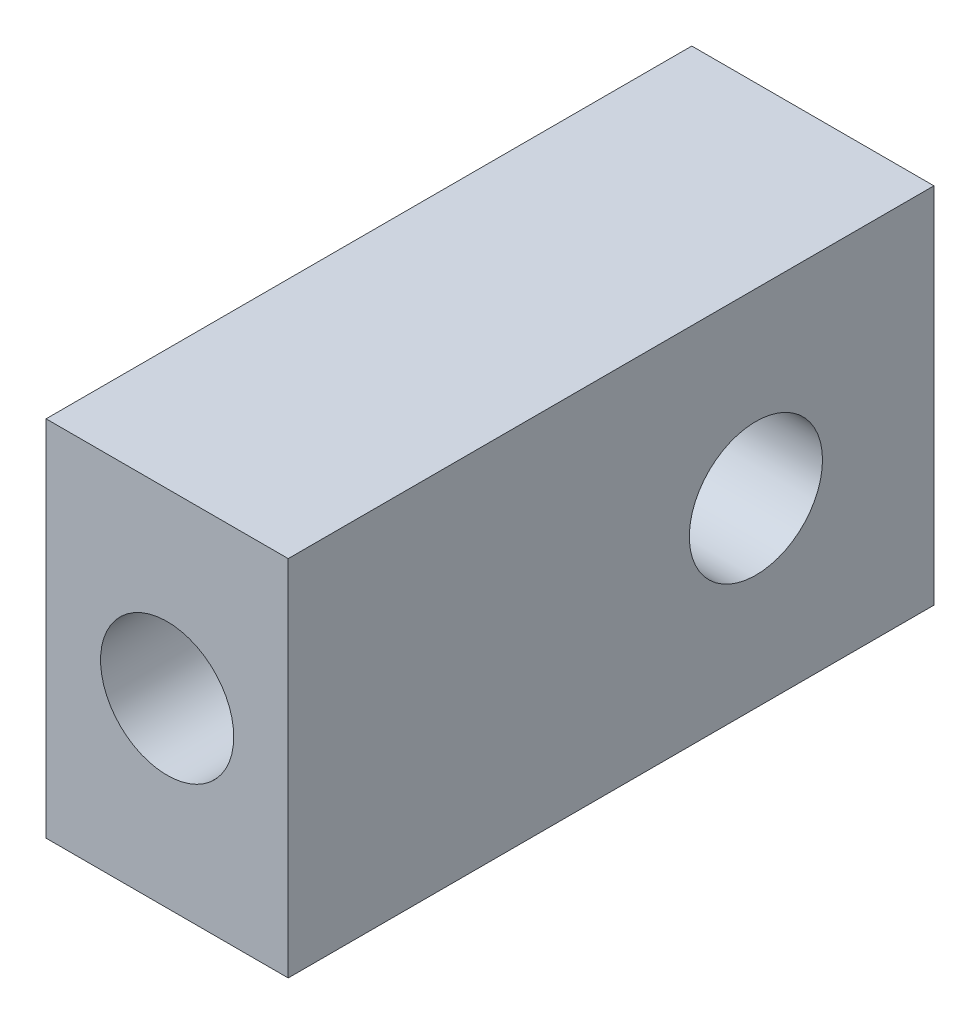
ISO-10303-21;
HEADER;
FILE_DESCRIPTION(('STEP AP214'),'2;1');
FILE_NAME('part.step','',(''),(''),'','','');
FILE_SCHEMA(('AUTOMOTIVE_DESIGN { 1 0 10303 214 1 1 1 1 }'));
ENDSEC;
DATA;
#1=APPLICATION_CONTEXT('core data for automotive mechanical design processes');
#2=APPLICATION_PROTOCOL_DEFINITION('international standard','automotive_design',2000,#1);
#3=PRODUCT_CONTEXT('',#1,'mechanical');
#4=PRODUCT('Part','Part','',(#3));
#5=PRODUCT_RELATED_PRODUCT_CATEGORY('part','',(#4));
#6=PRODUCT_DEFINITION_FORMATION('','',#4);
#7=PRODUCT_DEFINITION_CONTEXT('part definition',#1,'design');
#8=PRODUCT_DEFINITION('design','',#6,#7);
#9=PRODUCT_DEFINITION_SHAPE('','',#8);
#10=(LENGTH_UNIT() NAMED_UNIT(*) SI_UNIT(.MILLI.,.METRE.));
#11=(NAMED_UNIT(*) PLANE_ANGLE_UNIT() SI_UNIT($,.RADIAN.));
#12=(NAMED_UNIT(*) SI_UNIT($,.STERADIAN.) SOLID_ANGLE_UNIT());
#13=UNCERTAINTY_MEASURE_WITH_UNIT(LENGTH_MEASURE(1.E-05),#10,'distance_accuracy_value','');
#14=(GEOMETRIC_REPRESENTATION_CONTEXT(3) GLOBAL_UNCERTAINTY_ASSIGNED_CONTEXT((#13)) GLOBAL_UNIT_ASSIGNED_CONTEXT((#10,
#11,#12)) REPRESENTATION_CONTEXT('',''));
#15=CARTESIAN_POINT('',(0.,0.,0.));
#16=DIRECTION('',(0.,0.,1.));
#17=DIRECTION('',(1.,0.,0.));
#18=AXIS2_PLACEMENT_3D('',#15,#16,#17);
#19=CARTESIAN_POINT('',(3.,-4.5,16.));
#20=DIRECTION('',(-1.,0.,0.));
#21=DIRECTION('',(0.,0.,1.));
#22=AXIS2_PLACEMENT_3D('',#19,#20,#21);
#23=PLANE('',#22);
#24=CARTESIAN_POINT('',(3.,0.,4.41111802265938));
#25=DIRECTION('',(1.,0.,0.));
#26=DIRECTION('',(0.,0.,-1.));
#27=AXIS2_PLACEMENT_3D('',#24,#25,#26);
#28=CIRCLE('',#27,1.64999999999999);
#29=CARTESIAN_POINT('',(3.,0.,2.76111802265939));
#30=VERTEX_POINT('',#29);
#31=EDGE_CURVE('E147',#30,#30,#28,.T.);
#32=ORIENTED_EDGE('',*,*,#31,.F.);
#33=EDGE_LOOP('',(#32));
#34=FACE_BOUND('',#33,.T.);
#35=DIRECTION('',(0.,1.,0.));
#36=VECTOR('',#35,1.);
#37=CARTESIAN_POINT('',(3.,-4.5,0.));
#38=LINE('',#37,#36);
#39=CARTESIAN_POINT('',(3.,-4.5,0.));
#40=VERTEX_POINT('',#39);
#41=CARTESIAN_POINT('',(3.,4.5,0.));
#42=VERTEX_POINT('',#41);
#43=EDGE_CURVE('E96',#40,#42,#38,.T.);
#44=ORIENTED_EDGE('',*,*,#43,.T.);
#45=DIRECTION('',(0.,0.,-1.));
#46=VECTOR('',#45,1.);
#47=CARTESIAN_POINT('',(3.,4.5,16.));
#48=LINE('',#47,#46);
#49=CARTESIAN_POINT('',(3.,4.5,16.));
#50=VERTEX_POINT('',#49);
#51=EDGE_CURVE('E11',#50,#42,#48,.T.);
#52=ORIENTED_EDGE('',*,*,#51,.F.);
#53=DIRECTION('',(0.,1.,0.));
#54=VECTOR('',#53,1.);
#55=CARTESIAN_POINT('',(3.,-4.5,16.));
#56=LINE('',#55,#54);
#57=CARTESIAN_POINT('',(3.,-4.5,16.));
#58=VERTEX_POINT('',#57);
#59=EDGE_CURVE('E107',#58,#50,#56,.T.);
#60=ORIENTED_EDGE('',*,*,#59,.F.);
#61=DIRECTION('',(0.,0.,-1.));
#62=VECTOR('',#61,1.);
#63=CARTESIAN_POINT('',(3.,-4.5,16.));
#64=LINE('',#63,#62);
#65=EDGE_CURVE('E112',#58,#40,#64,.T.);
#66=ORIENTED_EDGE('',*,*,#65,.T.);
#67=EDGE_LOOP('',(#44,#52,#60,#66));
#68=FACE_BOUND('',#67,.T.);
#69=ADVANCED_FACE('F35',(#34,#68),#23,.F.);
#70=CARTESIAN_POINT('',(-3.,4.5,16.));
#71=DIRECTION('',(0.,-1.,0.));
#72=DIRECTION('',(0.,0.,-1.));
#73=AXIS2_PLACEMENT_3D('',#70,#71,#72);
#74=PLANE('',#73);
#75=DIRECTION('',(-1.,0.,0.));
#76=VECTOR('',#75,1.);
#77=CARTESIAN_POINT('',(-3.,4.5,0.));
#78=LINE('',#77,#76);
#79=CARTESIAN_POINT('',(-3.,4.5,0.));
#80=VERTEX_POINT('',#79);
#81=EDGE_CURVE('E100',#42,#80,#78,.T.);
#82=ORIENTED_EDGE('',*,*,#81,.T.);
#83=DIRECTION('',(0.,0.,-1.));
#84=VECTOR('',#83,1.);
#85=CARTESIAN_POINT('',(-3.,4.5,16.));
#86=LINE('',#85,#84);
#87=CARTESIAN_POINT('',(-3.,4.5,16.));
#88=VERTEX_POINT('',#87);
#89=EDGE_CURVE('E43',#88,#80,#86,.T.);
#90=ORIENTED_EDGE('',*,*,#89,.F.);
#91=DIRECTION('',(-1.,0.,0.));
#92=VECTOR('',#91,1.);
#93=CARTESIAN_POINT('',(-3.,4.5,16.));
#94=LINE('',#93,#92);
#95=EDGE_CURVE('E82',#50,#88,#94,.T.);
#96=ORIENTED_EDGE('',*,*,#95,.F.);
#97=ORIENTED_EDGE('',*,*,#51,.T.);
#98=EDGE_LOOP('',(#82,#90,#96,#97));
#99=FACE_BOUND('',#98,.T.);
#100=ADVANCED_FACE('F136',(#99),#74,.F.);
#101=CARTESIAN_POINT('',(-3.,-4.5,16.));
#102=DIRECTION('',(1.,0.,0.));
#103=DIRECTION('',(0.,0.,-1.));
#104=AXIS2_PLACEMENT_3D('',#101,#102,#103);
#105=PLANE('',#104);
#106=CARTESIAN_POINT('',(-3.,0.,4.41111802265938));
#107=DIRECTION('',(1.,0.,0.));
#108=DIRECTION('',(0.,0.,-1.));
#109=AXIS2_PLACEMENT_3D('',#106,#107,#108);
#110=CIRCLE('',#109,1.65);
#111=CARTESIAN_POINT('',(-3.,0.,2.76111802265938));
#112=VERTEX_POINT('',#111);
#113=EDGE_CURVE('E103',#112,#112,#110,.T.);
#114=ORIENTED_EDGE('',*,*,#113,.T.);
#115=EDGE_LOOP('',(#114));
#116=FACE_BOUND('',#115,.T.);
#117=DIRECTION('',(0.,-1.,0.));
#118=VECTOR('',#117,1.);
#119=CARTESIAN_POINT('',(-3.,-4.5,0.));
#120=LINE('',#119,#118);
#121=CARTESIAN_POINT('',(-3.,-4.5,0.));
#122=VERTEX_POINT('',#121);
#123=EDGE_CURVE('E69',#80,#122,#120,.T.);
#124=ORIENTED_EDGE('',*,*,#123,.T.);
#125=DIRECTION('',(0.,0.,-1.));
#126=VECTOR('',#125,1.);
#127=CARTESIAN_POINT('',(-3.,-4.5,16.));
#128=LINE('',#127,#126);
#129=CARTESIAN_POINT('',(-3.,-4.5,16.));
#130=VERTEX_POINT('',#129);
#131=EDGE_CURVE('E118',#130,#122,#128,.T.);
#132=ORIENTED_EDGE('',*,*,#131,.F.);
#133=DIRECTION('',(0.,-1.,0.));
#134=VECTOR('',#133,1.);
#135=CARTESIAN_POINT('',(-3.,-4.5,16.));
#136=LINE('',#135,#134);
#137=EDGE_CURVE('E110',#88,#130,#136,.T.);
#138=ORIENTED_EDGE('',*,*,#137,.F.);
#139=ORIENTED_EDGE('',*,*,#89,.T.);
#140=EDGE_LOOP('',(#124,#132,#138,#139));
#141=FACE_BOUND('',#140,.T.);
#142=ADVANCED_FACE('F120',(#116,#141),#105,.F.);
#143=CARTESIAN_POINT('',(-3.,-4.5,16.));
#144=DIRECTION('',(0.,1.,0.));
#145=DIRECTION('',(0.,0.,1.));
#146=AXIS2_PLACEMENT_3D('',#143,#144,#145);
#147=PLANE('',#146);
#148=DIRECTION('',(1.,0.,0.));
#149=VECTOR('',#148,1.);
#150=CARTESIAN_POINT('',(-3.,-4.5,0.));
#151=LINE('',#150,#149);
#152=EDGE_CURVE('E75',#122,#40,#151,.T.);
#153=ORIENTED_EDGE('',*,*,#152,.T.);
#154=ORIENTED_EDGE('',*,*,#65,.F.);
#155=DIRECTION('',(1.,0.,0.));
#156=VECTOR('',#155,1.);
#157=CARTESIAN_POINT('',(-3.,-4.5,16.));
#158=LINE('',#157,#156);
#159=EDGE_CURVE('E51',#130,#58,#158,.T.);
#160=ORIENTED_EDGE('',*,*,#159,.F.);
#161=ORIENTED_EDGE('',*,*,#131,.T.);
#162=EDGE_LOOP('',(#153,#154,#160,#161));
#163=FACE_BOUND('',#162,.T.);
#164=ADVANCED_FACE('F126',(#163),#147,.F.);
#165=CARTESIAN_POINT('',(0.,0.,16.));
#166=DIRECTION('',(0.,0.,-1.));
#167=DIRECTION('',(-1.,0.,0.));
#168=AXIS2_PLACEMENT_3D('',#165,#166,#167);
#169=PLANE('',#168);
#170=CARTESIAN_POINT('',(0.,0.,16.));
#171=DIRECTION('',(0.,0.,1.));
#172=DIRECTION('',(1.,0.,0.));
#173=AXIS2_PLACEMENT_3D('',#170,#171,#172);
#174=CIRCLE('',#173,1.64999999999999);
#175=CARTESIAN_POINT('',(1.64999999999999,0.,16.));
#176=VERTEX_POINT('',#175);
#177=EDGE_CURVE('E97',#176,#176,#174,.T.);
#178=ORIENTED_EDGE('',*,*,#177,.F.);
#179=EDGE_LOOP('',(#178));
#180=FACE_BOUND('',#179,.T.);
#181=ORIENTED_EDGE('',*,*,#59,.T.);
#182=ORIENTED_EDGE('',*,*,#95,.T.);
#183=ORIENTED_EDGE('',*,*,#137,.T.);
#184=ORIENTED_EDGE('',*,*,#159,.T.);
#185=EDGE_LOOP('',(#181,#182,#183,#184));
#186=FACE_BOUND('',#185,.T.);
#187=ADVANCED_FACE('F128',(#180,#186),#169,.F.);
#188=CARTESIAN_POINT('',(0.,0.,0.));
#189=DIRECTION('',(0.,0.,-1.));
#190=DIRECTION('',(-1.,0.,0.));
#191=AXIS2_PLACEMENT_3D('',#188,#189,#190);
#192=PLANE('',#191);
#193=ORIENTED_EDGE('',*,*,#43,.F.);
#194=ORIENTED_EDGE('',*,*,#152,.F.);
#195=ORIENTED_EDGE('',*,*,#123,.F.);
#196=ORIENTED_EDGE('',*,*,#81,.F.);
#197=EDGE_LOOP('',(#193,#194,#195,#196));
#198=FACE_BOUND('',#197,.T.);
#199=ADVANCED_FACE('F90',(#198),#192,.T.);
#200=CARTESIAN_POINT('',(0.,0.,10.));
#201=DIRECTION('',(0.,0.,1.));
#202=DIRECTION('',(1.,0.,0.));
#203=AXIS2_PLACEMENT_3D('',#200,#201,#202);
#204=CONICAL_SURFACE('',#203,1.65,1.02974425867665);
#205=CARTESIAN_POINT('',(0.,0.,9.00857997860453));
#206=VERTEX_POINT('',#205);
#207=VERTEX_LOOP('',#206);
#208=FACE_BOUND('',#207,.T.);
#209=CARTESIAN_POINT('',(0.,0.,10.));
#210=DIRECTION('',(0.,0.,1.));
#211=DIRECTION('',(1.,0.,0.));
#212=AXIS2_PLACEMENT_3D('',#209,#210,#211);
#213=CIRCLE('',#212,1.65);
#214=CARTESIAN_POINT('',(1.65,0.,10.));
#215=VERTEX_POINT('',#214);
#216=EDGE_CURVE('E94',#215,#215,#213,.T.);
#217=ORIENTED_EDGE('',*,*,#216,.T.);
#218=EDGE_LOOP('',(#217));
#219=FACE_BOUND('',#218,.T.);
#220=ADVANCED_FACE('F86',(#208,#219),#204,.F.);
#221=CARTESIAN_POINT('',(0.,0.,16.));
#222=DIRECTION('',(0.,0.,1.));
#223=DIRECTION('',(1.,0.,0.));
#224=AXIS2_PLACEMENT_3D('',#221,#222,#223);
#225=CYLINDRICAL_SURFACE('',#224,1.64999999999999);
#226=ORIENTED_EDGE('',*,*,#216,.F.);
#227=EDGE_LOOP('',(#226));
#228=FACE_BOUND('',#227,.T.);
#229=ORIENTED_EDGE('',*,*,#177,.T.);
#230=EDGE_LOOP('',(#229));
#231=FACE_BOUND('',#230,.T.);
#232=ADVANCED_FACE('F89',(#228,#231),#225,.F.);
#233=CARTESIAN_POINT('',(3.,0.,4.41111802265938));
#234=DIRECTION('',(1.,0.,0.));
#235=DIRECTION('',(0.,0.,-1.));
#236=AXIS2_PLACEMENT_3D('',#233,#234,#235);
#237=CYLINDRICAL_SURFACE('',#236,1.64999999999999);
#238=ORIENTED_EDGE('',*,*,#113,.F.);
#239=EDGE_LOOP('',(#238));
#240=FACE_BOUND('',#239,.T.);
#241=ORIENTED_EDGE('',*,*,#31,.T.);
#242=EDGE_LOOP('',(#241));
#243=FACE_BOUND('',#242,.T.);
#244=ADVANCED_FACE('F153',(#240,#243),#237,.F.);
#245=CLOSED_SHELL('',(#69,#100,#142,#164,#187,#199,#220,#232,#244));
#246=MANIFOLD_SOLID_BREP('B2',#245);
#247=ADVANCED_BREP_SHAPE_REPRESENTATION('',(#18,#246),#14);
#248=SHAPE_DEFINITION_REPRESENTATION(#9,#247);
ENDSEC;
END-ISO-10303-21;
